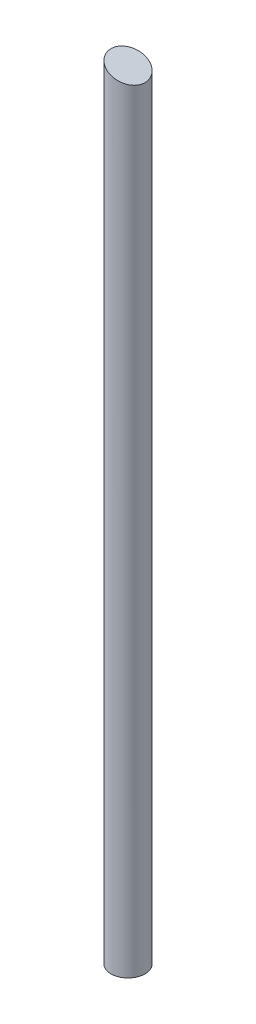
ISO-10303-21;
HEADER;
FILE_DESCRIPTION(('STEP AP214'),'2;1');
FILE_NAME('part.step','',(''),(''),'','','');
FILE_SCHEMA(('AUTOMOTIVE_DESIGN { 1 0 10303 214 1 1 1 1 }'));
ENDSEC;
DATA;
#1=APPLICATION_CONTEXT('core data for automotive mechanical design processes');
#2=APPLICATION_PROTOCOL_DEFINITION('international standard','automotive_design',2000,#1);
#3=PRODUCT_CONTEXT('',#1,'mechanical');
#4=PRODUCT('Part','Part','',(#3));
#5=PRODUCT_RELATED_PRODUCT_CATEGORY('part','',(#4));
#6=PRODUCT_DEFINITION_FORMATION('','',#4);
#7=PRODUCT_DEFINITION_CONTEXT('part definition',#1,'design');
#8=PRODUCT_DEFINITION('design','',#6,#7);
#9=PRODUCT_DEFINITION_SHAPE('','',#8);
#10=(LENGTH_UNIT() NAMED_UNIT(*) SI_UNIT(.MILLI.,.METRE.));
#11=(NAMED_UNIT(*) PLANE_ANGLE_UNIT() SI_UNIT($,.RADIAN.));
#12=(NAMED_UNIT(*) SI_UNIT($,.STERADIAN.) SOLID_ANGLE_UNIT());
#13=UNCERTAINTY_MEASURE_WITH_UNIT(LENGTH_MEASURE(1.E-05),#10,'distance_accuracy_value','');
#14=(GEOMETRIC_REPRESENTATION_CONTEXT(3) GLOBAL_UNCERTAINTY_ASSIGNED_CONTEXT((#13)) GLOBAL_UNIT_ASSIGNED_CONTEXT((#10,
#11,#12)) REPRESENTATION_CONTEXT('',''));
#15=CARTESIAN_POINT('',(0.,0.,0.));
#16=DIRECTION('',(0.,0.,1.));
#17=DIRECTION('',(1.,0.,0.));
#18=AXIS2_PLACEMENT_3D('',#15,#16,#17);
#19=CARTESIAN_POINT('',(0.,138.,0.));
#20=DIRECTION('',(0.,-1.,0.));
#21=DIRECTION('',(0.,0.,-1.));
#22=AXIS2_PLACEMENT_3D('',#19,#20,#21);
#23=CYLINDRICAL_SURFACE('',#22,3.);
#24=CARTESIAN_POINT('',(0.,136.908089297201,0.));
#25=DIRECTION('',(-0.342020143325662,-0.939692620785911,0.));
#26=DIRECTION('',(0.939692620785911,-0.342020143325662,0.));
#27=AXIS2_PLACEMENT_3D('',#24,#25,#26);
#28=ELLIPSE('',#27,3.19253331742773,3.);
#29=CARTESIAN_POINT('',(3.,135.816178594403,0.));
#30=VERTEX_POINT('',#29);
#31=EDGE_CURVE('E37',#30,#30,#28,.T.);
#32=ORIENTED_EDGE('',*,*,#31,.T.);
#33=EDGE_LOOP('',(#32));
#34=FACE_BOUND('',#33,.T.);
#35=CARTESIAN_POINT('',(0.,0.,0.));
#36=DIRECTION('',(0.,1.,0.));
#37=DIRECTION('',(0.,0.,1.));
#38=AXIS2_PLACEMENT_3D('',#35,#36,#37);
#39=CIRCLE('',#38,3.);
#40=CARTESIAN_POINT('',(0.,0.,3.));
#41=VERTEX_POINT('',#40);
#42=EDGE_CURVE('E10',#41,#41,#39,.T.);
#43=ORIENTED_EDGE('',*,*,#42,.T.);
#44=EDGE_LOOP('',(#43));
#45=FACE_BOUND('',#44,.T.);
#46=ADVANCED_FACE('F31',(#34,#45),#23,.T.);
#47=CARTESIAN_POINT('',(0.,0.,0.));
#48=DIRECTION('',(0.,1.,0.));
#49=DIRECTION('',(0.,0.,1.));
#50=AXIS2_PLACEMENT_3D('',#47,#48,#49);
#51=PLANE('',#50);
#52=ORIENTED_EDGE('',*,*,#42,.F.);
#53=EDGE_LOOP('',(#52));
#54=FACE_BOUND('',#53,.T.);
#55=ADVANCED_FACE('F46',(#54),#51,.F.);
#56=CARTESIAN_POINT('',(-3.,138.,-5.));
#57=DIRECTION('',(-0.342020143325662,-0.939692620785911,0.));
#58=DIRECTION('',(0.939692620785911,-0.342020143325662,0.));
#59=AXIS2_PLACEMENT_3D('',#56,#57,#58);
#60=PLANE('',#59);
#61=ORIENTED_EDGE('',*,*,#31,.F.);
#62=EDGE_LOOP('',(#61));
#63=FACE_BOUND('',#62,.T.);
#64=ADVANCED_FACE('F44',(#63),#60,.F.);
#65=CLOSED_SHELL('',(#46,#55,#64));
#66=MANIFOLD_SOLID_BREP('B2',#65);
#67=ADVANCED_BREP_SHAPE_REPRESENTATION('',(#18,#66),#14);
#68=SHAPE_DEFINITION_REPRESENTATION(#9,#67);
ENDSEC;
END-ISO-10303-21;
